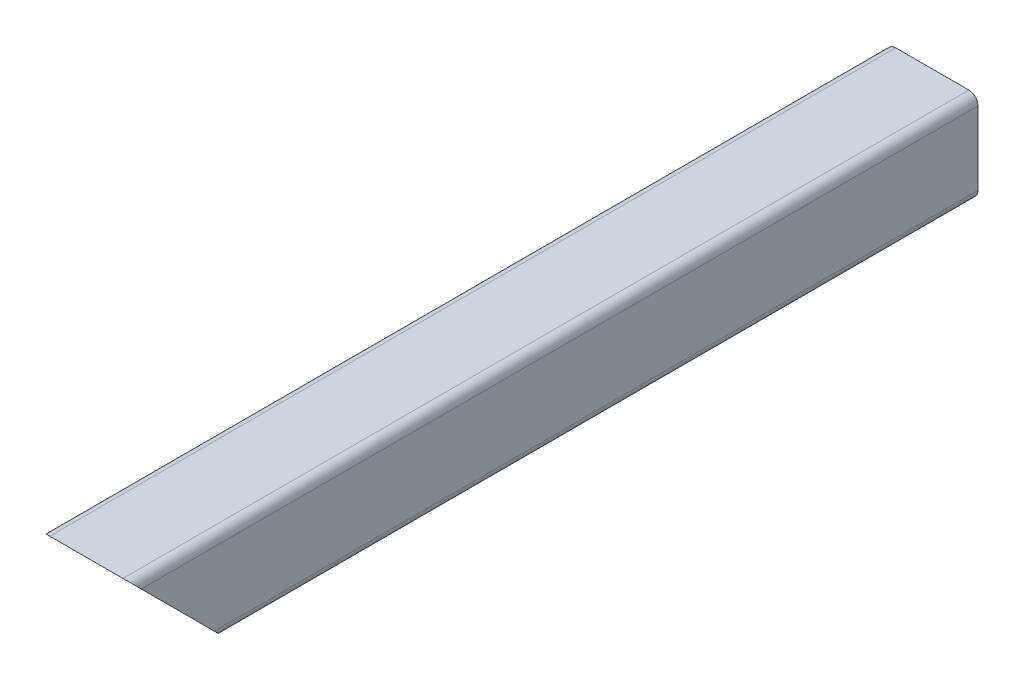
ISO-10303-21;
HEADER;
FILE_DESCRIPTION(('STEP AP214'),'2;1');
FILE_NAME('part.step','',(''),(''),'','','');
FILE_SCHEMA(('AUTOMOTIVE_DESIGN { 1 0 10303 214 1 1 1 1 }'));
ENDSEC;
DATA;
#1=APPLICATION_CONTEXT('core data for automotive mechanical design processes');
#2=APPLICATION_PROTOCOL_DEFINITION('international standard','automotive_design',2000,#1);
#3=PRODUCT_CONTEXT('',#1,'mechanical');
#4=PRODUCT('Part','Part','',(#3));
#5=PRODUCT_RELATED_PRODUCT_CATEGORY('part','',(#4));
#6=PRODUCT_DEFINITION_FORMATION('','',#4);
#7=PRODUCT_DEFINITION_CONTEXT('part definition',#1,'design');
#8=PRODUCT_DEFINITION('design','',#6,#7);
#9=PRODUCT_DEFINITION_SHAPE('','',#8);
#10=(LENGTH_UNIT() NAMED_UNIT(*) SI_UNIT(.MILLI.,.METRE.));
#11=(NAMED_UNIT(*) PLANE_ANGLE_UNIT() SI_UNIT($,.RADIAN.));
#12=(NAMED_UNIT(*) SI_UNIT($,.STERADIAN.) SOLID_ANGLE_UNIT());
#13=UNCERTAINTY_MEASURE_WITH_UNIT(LENGTH_MEASURE(1.E-05),#10,'distance_accuracy_value','');
#14=(GEOMETRIC_REPRESENTATION_CONTEXT(3) GLOBAL_UNCERTAINTY_ASSIGNED_CONTEXT((#13)) GLOBAL_UNIT_ASSIGNED_CONTEXT((#10,
#11,#12)) REPRESENTATION_CONTEXT('',''));
#15=CARTESIAN_POINT('',(0.,0.,0.));
#16=DIRECTION('',(0.,0.,1.));
#17=DIRECTION('',(1.,0.,0.));
#18=AXIS2_PLACEMENT_3D('',#15,#16,#17);
#19=CARTESIAN_POINT('',(16.,-16.,370.));
#20=DIRECTION('',(0.,0.,-1.));
#21=DIRECTION('',(-1.,0.,0.));
#22=AXIS2_PLACEMENT_3D('',#19,#20,#21);
#23=CYLINDRICAL_SURFACE('',#22,4.);
#24=CARTESIAN_POINT('',(16.,-16.,334.));
#25=DIRECTION('',(0.,-0.707106781186544,0.707106781186551));
#26=DIRECTION('',(0.,-0.707106781186551,-0.707106781186544));
#27=AXIS2_PLACEMENT_3D('',#24,#25,#26);
#28=ELLIPSE('',#27,5.65685424949235,4.);
#29=CARTESIAN_POINT('',(16.,-20.,330.));
#30=VERTEX_POINT('',#29);
#31=CARTESIAN_POINT('',(20.,-16.,334.));
#32=VERTEX_POINT('',#31);
#33=EDGE_CURVE('E145',#30,#32,#28,.T.);
#34=ORIENTED_EDGE('',*,*,#33,.F.);
#35=DIRECTION('',(0.,0.,-1.));
#36=VECTOR('',#35,1.);
#37=CARTESIAN_POINT('',(16.,-20.,370.));
#38=LINE('',#37,#36);
#39=CARTESIAN_POINT('',(16.,-20.,0.));
#40=VERTEX_POINT('',#39);
#41=EDGE_CURVE('E155',#30,#40,#38,.T.);
#42=ORIENTED_EDGE('',*,*,#41,.T.);
#43=CARTESIAN_POINT('',(16.,-16.,0.));
#44=DIRECTION('',(0.,0.,1.));
#45=DIRECTION('',(-1.,0.,0.));
#46=AXIS2_PLACEMENT_3D('',#43,#44,#45);
#47=CIRCLE('',#46,4.);
#48=CARTESIAN_POINT('',(20.,-16.,0.));
#49=VERTEX_POINT('',#48);
#50=EDGE_CURVE('E193',#40,#49,#47,.T.);
#51=ORIENTED_EDGE('',*,*,#50,.T.);
#52=DIRECTION('',(0.,0.,-1.));
#53=VECTOR('',#52,1.);
#54=CARTESIAN_POINT('',(20.,-16.,370.));
#55=LINE('',#54,#53);
#56=EDGE_CURVE('E41',#32,#49,#55,.T.);
#57=ORIENTED_EDGE('',*,*,#56,.F.);
#58=EDGE_LOOP('',(#34,#42,#51,#57));
#59=FACE_BOUND('',#58,.T.);
#60=ADVANCED_FACE('F34',(#59),#23,.T.);
#61=CARTESIAN_POINT('',(20.,16.,370.));
#62=DIRECTION('',(-1.,0.,0.));
#63=DIRECTION('',(0.,-1.,0.));
#64=AXIS2_PLACEMENT_3D('',#61,#62,#63);
#65=PLANE('',#64);
#66=DIRECTION('',(0.,0.707106781186551,0.707106781186544));
#67=VECTOR('',#66,1.);
#68=CARTESIAN_POINT('',(20.,18.,368.));
#69=LINE('',#68,#67);
#70=CARTESIAN_POINT('',(20.,16.,366.));
#71=VERTEX_POINT('',#70);
#72=EDGE_CURVE('E158',#32,#71,#69,.T.);
#73=ORIENTED_EDGE('',*,*,#72,.F.);
#74=ORIENTED_EDGE('',*,*,#56,.T.);
#75=DIRECTION('',(0.,1.,0.));
#76=VECTOR('',#75,1.);
#77=CARTESIAN_POINT('',(20.,16.,0.));
#78=LINE('',#77,#76);
#79=CARTESIAN_POINT('',(20.,16.,0.));
#80=VERTEX_POINT('',#79);
#81=EDGE_CURVE('E188',#49,#80,#78,.T.);
#82=ORIENTED_EDGE('',*,*,#81,.T.);
#83=DIRECTION('',(0.,0.,-1.));
#84=VECTOR('',#83,1.);
#85=CARTESIAN_POINT('',(20.,16.,370.));
#86=LINE('',#85,#84);
#87=EDGE_CURVE('E182',#71,#80,#86,.T.);
#88=ORIENTED_EDGE('',*,*,#87,.F.);
#89=EDGE_LOOP('',(#73,#74,#82,#88));
#90=FACE_BOUND('',#89,.T.);
#91=ADVANCED_FACE('F186',(#90),#65,.F.);
#92=CARTESIAN_POINT('',(16.,16.,370.));
#93=DIRECTION('',(0.,0.,-1.));
#94=DIRECTION('',(-1.,0.,0.));
#95=AXIS2_PLACEMENT_3D('',#92,#93,#94);
#96=CYLINDRICAL_SURFACE('',#95,4.);
#97=CARTESIAN_POINT('',(16.,16.,366.));
#98=DIRECTION('',(0.,-0.707106781186544,0.707106781186551));
#99=DIRECTION('',(0.,-0.707106781186551,-0.707106781186544));
#100=AXIS2_PLACEMENT_3D('',#97,#98,#99);
#101=ELLIPSE('',#100,5.65685424949235,4.);
#102=CARTESIAN_POINT('',(16.,20.,370.));
#103=VERTEX_POINT('',#102);
#104=EDGE_CURVE('E235',#71,#103,#101,.T.);
#105=ORIENTED_EDGE('',*,*,#104,.F.);
#106=ORIENTED_EDGE('',*,*,#87,.T.);
#107=CARTESIAN_POINT('',(16.,16.,0.));
#108=DIRECTION('',(0.,0.,1.));
#109=DIRECTION('',(-1.,0.,0.));
#110=AXIS2_PLACEMENT_3D('',#107,#108,#109);
#111=CIRCLE('',#110,4.);
#112=CARTESIAN_POINT('',(16.,20.,0.));
#113=VERTEX_POINT('',#112);
#114=EDGE_CURVE('E195',#80,#113,#111,.T.);
#115=ORIENTED_EDGE('',*,*,#114,.T.);
#116=DIRECTION('',(0.,0.,-1.));
#117=VECTOR('',#116,1.);
#118=CARTESIAN_POINT('',(16.,20.,370.));
#119=LINE('',#118,#117);
#120=EDGE_CURVE('E179',#103,#113,#119,.T.);
#121=ORIENTED_EDGE('',*,*,#120,.F.);
#122=EDGE_LOOP('',(#105,#106,#115,#121));
#123=FACE_BOUND('',#122,.T.);
#124=ADVANCED_FACE('F234',(#123),#96,.T.);
#125=CARTESIAN_POINT('',(-16.,16.,370.));
#126=DIRECTION('',(0.,0.,-1.));
#127=DIRECTION('',(-1.,0.,0.));
#128=AXIS2_PLACEMENT_3D('',#125,#126,#127);
#129=CYLINDRICAL_SURFACE('',#128,4.);
#130=CARTESIAN_POINT('',(-16.,16.,366.));
#131=DIRECTION('',(0.,-0.707106781186544,0.707106781186551));
#132=DIRECTION('',(0.,-0.707106781186551,-0.707106781186544));
#133=AXIS2_PLACEMENT_3D('',#130,#131,#132);
#134=ELLIPSE('',#133,5.65685424949235,4.);
#135=CARTESIAN_POINT('',(-16.,20.,370.));
#136=VERTEX_POINT('',#135);
#137=CARTESIAN_POINT('',(-20.,16.,366.));
#138=VERTEX_POINT('',#137);
#139=EDGE_CURVE('E227',#136,#138,#134,.T.);
#140=ORIENTED_EDGE('',*,*,#139,.F.);
#141=DIRECTION('',(0.,0.,-1.));
#142=VECTOR('',#141,1.);
#143=CARTESIAN_POINT('',(-16.,20.,370.));
#144=LINE('',#143,#142);
#145=CARTESIAN_POINT('',(-16.,20.,0.));
#146=VERTEX_POINT('',#145);
#147=EDGE_CURVE('E176',#136,#146,#144,.T.);
#148=ORIENTED_EDGE('',*,*,#147,.T.);
#149=CARTESIAN_POINT('',(-16.,16.,0.));
#150=DIRECTION('',(0.,0.,1.));
#151=DIRECTION('',(1.,0.,0.));
#152=AXIS2_PLACEMENT_3D('',#149,#150,#151);
#153=CIRCLE('',#152,4.);
#154=CARTESIAN_POINT('',(-20.,16.,0.));
#155=VERTEX_POINT('',#154);
#156=EDGE_CURVE('E205',#146,#155,#153,.T.);
#157=ORIENTED_EDGE('',*,*,#156,.T.);
#158=DIRECTION('',(0.,0.,-1.));
#159=VECTOR('',#158,1.);
#160=CARTESIAN_POINT('',(-20.,16.,370.));
#161=LINE('',#160,#159);
#162=EDGE_CURVE('E174',#138,#155,#161,.T.);
#163=ORIENTED_EDGE('',*,*,#162,.F.);
#164=EDGE_LOOP('',(#140,#148,#157,#163));
#165=FACE_BOUND('',#164,.T.);
#166=ADVANCED_FACE('F225',(#165),#129,.T.);
#167=CARTESIAN_POINT('',(-20.,16.,370.));
#168=DIRECTION('',(1.,0.,0.));
#169=DIRECTION('',(0.,1.,0.));
#170=AXIS2_PLACEMENT_3D('',#167,#168,#169);
#171=PLANE('',#170);
#172=DIRECTION('',(0.,-0.707106781186551,-0.707106781186544));
#173=VECTOR('',#172,1.);
#174=CARTESIAN_POINT('',(-20.,18.,368.));
#175=LINE('',#174,#173);
#176=CARTESIAN_POINT('',(-20.,-16.,334.));
#177=VERTEX_POINT('',#176);
#178=EDGE_CURVE('E222',#138,#177,#175,.T.);
#179=ORIENTED_EDGE('',*,*,#178,.F.);
#180=ORIENTED_EDGE('',*,*,#162,.T.);
#181=DIRECTION('',(0.,-1.,0.));
#182=VECTOR('',#181,1.);
#183=CARTESIAN_POINT('',(-20.,16.,0.));
#184=LINE('',#183,#182);
#185=CARTESIAN_POINT('',(-20.,-16.,0.));
#186=VERTEX_POINT('',#185);
#187=EDGE_CURVE('E208',#155,#186,#184,.T.);
#188=ORIENTED_EDGE('',*,*,#187,.T.);
#189=DIRECTION('',(0.,0.,-1.));
#190=VECTOR('',#189,1.);
#191=CARTESIAN_POINT('',(-20.,-16.,370.));
#192=LINE('',#191,#190);
#193=EDGE_CURVE('E167',#177,#186,#192,.T.);
#194=ORIENTED_EDGE('',*,*,#193,.F.);
#195=EDGE_LOOP('',(#179,#180,#188,#194));
#196=FACE_BOUND('',#195,.T.);
#197=ADVANCED_FACE('F220',(#196),#171,.F.);
#198=CARTESIAN_POINT('',(-16.,-16.,370.));
#199=DIRECTION('',(0.,0.,-1.));
#200=DIRECTION('',(-1.,0.,0.));
#201=AXIS2_PLACEMENT_3D('',#198,#199,#200);
#202=CYLINDRICAL_SURFACE('',#201,4.);
#203=CARTESIAN_POINT('',(-16.,-16.,334.));
#204=DIRECTION('',(0.,-0.707106781186544,0.707106781186551));
#205=DIRECTION('',(0.,-0.707106781186551,-0.707106781186544));
#206=AXIS2_PLACEMENT_3D('',#203,#204,#205);
#207=ELLIPSE('',#206,5.65685424949236,4.);
#208=CARTESIAN_POINT('',(-16.,-20.,330.));
#209=VERTEX_POINT('',#208);
#210=EDGE_CURVE('E48',#177,#209,#207,.T.);
#211=ORIENTED_EDGE('',*,*,#210,.F.);
#212=ORIENTED_EDGE('',*,*,#193,.T.);
#213=CARTESIAN_POINT('',(-16.,-16.,0.));
#214=DIRECTION('',(0.,0.,1.));
#215=DIRECTION('',(1.,0.,0.));
#216=AXIS2_PLACEMENT_3D('',#213,#214,#215);
#217=CIRCLE('',#216,4.);
#218=CARTESIAN_POINT('',(-16.,-20.,0.));
#219=VERTEX_POINT('',#218);
#220=EDGE_CURVE('E210',#186,#219,#217,.T.);
#221=ORIENTED_EDGE('',*,*,#220,.T.);
#222=DIRECTION('',(0.,0.,-1.));
#223=VECTOR('',#222,1.);
#224=CARTESIAN_POINT('',(-16.,-20.,370.));
#225=LINE('',#224,#223);
#226=EDGE_CURVE('E164',#209,#219,#225,.T.);
#227=ORIENTED_EDGE('',*,*,#226,.F.);
#228=EDGE_LOOP('',(#211,#212,#221,#227));
#229=FACE_BOUND('',#228,.T.);
#230=ADVANCED_FACE('F214',(#229),#202,.T.);
#231=CARTESIAN_POINT('',(-16.,-20.,370.));
#232=DIRECTION('',(0.,1.,0.));
#233=DIRECTION('',(0.,0.,1.));
#234=AXIS2_PLACEMENT_3D('',#231,#232,#233);
#235=PLANE('',#234);
#236=DIRECTION('',(-1.,0.,0.));
#237=VECTOR('',#236,1.);
#238=CARTESIAN_POINT('',(41.,-20.,330.));
#239=LINE('',#238,#237);
#240=EDGE_CURVE('E142',#30,#209,#239,.T.);
#241=ORIENTED_EDGE('',*,*,#240,.T.);
#242=ORIENTED_EDGE('',*,*,#226,.T.);
#243=DIRECTION('',(1.,0.,0.));
#244=VECTOR('',#243,1.);
#245=CARTESIAN_POINT('',(-16.,-20.,0.));
#246=LINE('',#245,#244);
#247=EDGE_CURVE('E162',#219,#40,#246,.T.);
#248=ORIENTED_EDGE('',*,*,#247,.T.);
#249=ORIENTED_EDGE('',*,*,#41,.F.);
#250=EDGE_LOOP('',(#241,#242,#248,#249));
#251=FACE_BOUND('',#250,.T.);
#252=ADVANCED_FACE('F160',(#251),#235,.F.);
#253=CARTESIAN_POINT('',(-16.,16.,370.));
#254=DIRECTION('',(0.,0.,-1.));
#255=DIRECTION('',(-1.,0.,0.));
#256=AXIS2_PLACEMENT_3D('',#253,#254,#255);
#257=CYLINDRICAL_SURFACE('',#256,2.);
#258=DIRECTION('',(0.,0.,-1.));
#259=VECTOR('',#258,1.);
#260=CARTESIAN_POINT('',(-16.,18.,370.));
#261=LINE('',#260,#259);
#262=CARTESIAN_POINT('',(-16.,18.,368.));
#263=VERTEX_POINT('',#262);
#264=CARTESIAN_POINT('',(-16.,18.,0.));
#265=VERTEX_POINT('',#264);
#266=EDGE_CURVE('E264',#263,#265,#261,.T.);
#267=ORIENTED_EDGE('',*,*,#266,.F.);
#268=CARTESIAN_POINT('',(-16.,16.,366.));
#269=DIRECTION('',(0.,-0.707106781186544,0.707106781186551));
#270=DIRECTION('',(0.,-0.707106781186551,-0.707106781186544));
#271=AXIS2_PLACEMENT_3D('',#268,#269,#270);
#272=ELLIPSE('',#271,2.82842712474617,2.);
#273=CARTESIAN_POINT('',(-18.,16.,366.));
#274=VERTEX_POINT('',#273);
#275=EDGE_CURVE('E56',#263,#274,#272,.T.);
#276=ORIENTED_EDGE('',*,*,#275,.T.);
#277=DIRECTION('',(0.,0.,-1.));
#278=VECTOR('',#277,1.);
#279=CARTESIAN_POINT('',(-18.,16.,370.));
#280=LINE('',#279,#278);
#281=CARTESIAN_POINT('',(-18.,16.,0.));
#282=VERTEX_POINT('',#281);
#283=EDGE_CURVE('E197',#274,#282,#280,.T.);
#284=ORIENTED_EDGE('',*,*,#283,.T.);
#285=CARTESIAN_POINT('',(-16.,16.,0.));
#286=DIRECTION('',(0.,0.,1.));
#287=DIRECTION('',(1.,0.,0.));
#288=AXIS2_PLACEMENT_3D('',#285,#286,#287);
#289=CIRCLE('',#288,2.);
#290=EDGE_CURVE('E157',#265,#282,#289,.T.);
#291=ORIENTED_EDGE('',*,*,#290,.F.);
#292=EDGE_LOOP('',(#267,#276,#284,#291));
#293=FACE_BOUND('',#292,.T.);
#294=ADVANCED_FACE('F293',(#293),#257,.F.);
#295=CARTESIAN_POINT('',(-18.,16.,370.));
#296=DIRECTION('',(1.,0.,0.));
#297=DIRECTION('',(0.,1.,0.));
#298=AXIS2_PLACEMENT_3D('',#295,#296,#297);
#299=PLANE('',#298);
#300=ORIENTED_EDGE('',*,*,#283,.F.);
#301=DIRECTION('',(0.,-0.707106781186551,-0.707106781186544));
#302=VECTOR('',#301,1.);
#303=CARTESIAN_POINT('',(-18.,18.,368.));
#304=LINE('',#303,#302);
#305=CARTESIAN_POINT('',(-18.,-16.,334.));
#306=VERTEX_POINT('',#305);
#307=EDGE_CURVE('E283',#274,#306,#304,.T.);
#308=ORIENTED_EDGE('',*,*,#307,.T.);
#309=DIRECTION('',(0.,0.,-1.));
#310=VECTOR('',#309,1.);
#311=CARTESIAN_POINT('',(-18.,-16.,370.));
#312=LINE('',#311,#310);
#313=CARTESIAN_POINT('',(-18.,-16.,0.));
#314=VERTEX_POINT('',#313);
#315=EDGE_CURVE('E199',#306,#314,#312,.T.);
#316=ORIENTED_EDGE('',*,*,#315,.T.);
#317=DIRECTION('',(0.,-1.,0.));
#318=VECTOR('',#317,1.);
#319=CARTESIAN_POINT('',(-18.,16.,0.));
#320=LINE('',#319,#318);
#321=EDGE_CURVE('E243',#282,#314,#320,.T.);
#322=ORIENTED_EDGE('',*,*,#321,.F.);
#323=EDGE_LOOP('',(#300,#308,#316,#322));
#324=FACE_BOUND('',#323,.T.);
#325=ADVANCED_FACE('F282',(#324),#299,.T.);
#326=CARTESIAN_POINT('',(-16.,-16.,370.));
#327=DIRECTION('',(0.,0.,-1.));
#328=DIRECTION('',(-1.,0.,0.));
#329=AXIS2_PLACEMENT_3D('',#326,#327,#328);
#330=CYLINDRICAL_SURFACE('',#329,2.);
#331=ORIENTED_EDGE('',*,*,#315,.F.);
#332=CARTESIAN_POINT('',(-16.,-16.,334.));
#333=DIRECTION('',(0.,-0.707106781186544,0.707106781186551));
#334=DIRECTION('',(0.,-0.707106781186551,-0.707106781186544));
#335=AXIS2_PLACEMENT_3D('',#332,#333,#334);
#336=ELLIPSE('',#335,2.82842712474618,2.);
#337=CARTESIAN_POINT('',(-16.,-18.,332.));
#338=VERTEX_POINT('',#337);
#339=EDGE_CURVE('E296',#306,#338,#336,.T.);
#340=ORIENTED_EDGE('',*,*,#339,.T.);
#341=DIRECTION('',(0.,0.,-1.));
#342=VECTOR('',#341,1.);
#343=CARTESIAN_POINT('',(-16.,-18.,370.));
#344=LINE('',#343,#342);
#345=CARTESIAN_POINT('',(-16.,-18.,0.));
#346=VERTEX_POINT('',#345);
#347=EDGE_CURVE('E274',#338,#346,#344,.T.);
#348=ORIENTED_EDGE('',*,*,#347,.T.);
#349=CARTESIAN_POINT('',(-16.,-16.,0.));
#350=DIRECTION('',(0.,0.,1.));
#351=DIRECTION('',(1.,0.,0.));
#352=AXIS2_PLACEMENT_3D('',#349,#350,#351);
#353=CIRCLE('',#352,2.);
#354=EDGE_CURVE('E246',#314,#346,#353,.T.);
#355=ORIENTED_EDGE('',*,*,#354,.F.);
#356=EDGE_LOOP('',(#331,#340,#348,#355));
#357=FACE_BOUND('',#356,.T.);
#358=ADVANCED_FACE('F286',(#357),#330,.F.);
#359=CARTESIAN_POINT('',(-16.,-18.,370.));
#360=DIRECTION('',(0.,1.,0.));
#361=DIRECTION('',(0.,0.,1.));
#362=AXIS2_PLACEMENT_3D('',#359,#360,#361);
#363=PLANE('',#362);
#364=ORIENTED_EDGE('',*,*,#347,.F.);
#365=DIRECTION('',(1.,0.,0.));
#366=VECTOR('',#365,1.);
#367=CARTESIAN_POINT('',(-16.,-18.,332.));
#368=LINE('',#367,#366);
#369=CARTESIAN_POINT('',(16.,-18.,332.));
#370=VERTEX_POINT('',#369);
#371=EDGE_CURVE('E300',#338,#370,#368,.T.);
#372=ORIENTED_EDGE('',*,*,#371,.T.);
#373=DIRECTION('',(0.,0.,-1.));
#374=VECTOR('',#373,1.);
#375=CARTESIAN_POINT('',(16.,-18.,370.));
#376=LINE('',#375,#374);
#377=CARTESIAN_POINT('',(16.,-18.,0.));
#378=VERTEX_POINT('',#377);
#379=EDGE_CURVE('E272',#370,#378,#376,.T.);
#380=ORIENTED_EDGE('',*,*,#379,.T.);
#381=DIRECTION('',(1.,0.,0.));
#382=VECTOR('',#381,1.);
#383=CARTESIAN_POINT('',(-16.,-18.,0.));
#384=LINE('',#383,#382);
#385=EDGE_CURVE('E249',#346,#378,#384,.T.);
#386=ORIENTED_EDGE('',*,*,#385,.F.);
#387=EDGE_LOOP('',(#364,#372,#380,#386));
#388=FACE_BOUND('',#387,.T.);
#389=ADVANCED_FACE('F326',(#388),#363,.T.);
#390=CARTESIAN_POINT('',(16.,-16.,370.));
#391=DIRECTION('',(0.,0.,-1.));
#392=DIRECTION('',(-1.,0.,0.));
#393=AXIS2_PLACEMENT_3D('',#390,#391,#392);
#394=CYLINDRICAL_SURFACE('',#393,2.);
#395=ORIENTED_EDGE('',*,*,#379,.F.);
#396=CARTESIAN_POINT('',(16.,-16.,334.));
#397=DIRECTION('',(0.,-0.707106781186544,0.707106781186551));
#398=DIRECTION('',(0.,-0.707106781186551,-0.707106781186544));
#399=AXIS2_PLACEMENT_3D('',#396,#397,#398);
#400=ELLIPSE('',#399,2.82842712474618,2.);
#401=CARTESIAN_POINT('',(18.,-16.,334.));
#402=VERTEX_POINT('',#401);
#403=EDGE_CURVE('E303',#370,#402,#400,.T.);
#404=ORIENTED_EDGE('',*,*,#403,.T.);
#405=DIRECTION('',(0.,0.,-1.));
#406=VECTOR('',#405,1.);
#407=CARTESIAN_POINT('',(18.,-16.,370.));
#408=LINE('',#407,#406);
#409=CARTESIAN_POINT('',(18.,-16.,0.));
#410=VERTEX_POINT('',#409);
#411=EDGE_CURVE('E270',#402,#410,#408,.T.);
#412=ORIENTED_EDGE('',*,*,#411,.T.);
#413=CARTESIAN_POINT('',(16.,-16.,0.));
#414=DIRECTION('',(0.,0.,1.));
#415=DIRECTION('',(-1.,0.,0.));
#416=AXIS2_PLACEMENT_3D('',#413,#414,#415);
#417=CIRCLE('',#416,2.);
#418=EDGE_CURVE('E252',#378,#410,#417,.T.);
#419=ORIENTED_EDGE('',*,*,#418,.F.);
#420=EDGE_LOOP('',(#395,#404,#412,#419));
#421=FACE_BOUND('',#420,.T.);
#422=ADVANCED_FACE('F324',(#421),#394,.F.);
#423=CARTESIAN_POINT('',(18.,16.,370.));
#424=DIRECTION('',(-1.,0.,0.));
#425=DIRECTION('',(0.,0.,1.));
#426=AXIS2_PLACEMENT_3D('',#423,#424,#425);
#427=PLANE('',#426);
#428=ORIENTED_EDGE('',*,*,#411,.F.);
#429=DIRECTION('',(0.,0.707106781186551,0.707106781186544));
#430=VECTOR('',#429,1.);
#431=CARTESIAN_POINT('',(18.,18.,368.));
#432=LINE('',#431,#430);
#433=CARTESIAN_POINT('',(18.,16.,366.));
#434=VERTEX_POINT('',#433);
#435=EDGE_CURVE('E306',#402,#434,#432,.T.);
#436=ORIENTED_EDGE('',*,*,#435,.T.);
#437=DIRECTION('',(0.,0.,-1.));
#438=VECTOR('',#437,1.);
#439=CARTESIAN_POINT('',(18.,16.,370.));
#440=LINE('',#439,#438);
#441=CARTESIAN_POINT('',(18.,16.,0.));
#442=VERTEX_POINT('',#441);
#443=EDGE_CURVE('E268',#434,#442,#440,.T.);
#444=ORIENTED_EDGE('',*,*,#443,.T.);
#445=DIRECTION('',(0.,1.,0.));
#446=VECTOR('',#445,1.);
#447=CARTESIAN_POINT('',(18.,16.,0.));
#448=LINE('',#447,#446);
#449=EDGE_CURVE('E255',#410,#442,#448,.T.);
#450=ORIENTED_EDGE('',*,*,#449,.F.);
#451=EDGE_LOOP('',(#428,#436,#444,#450));
#452=FACE_BOUND('',#451,.T.);
#453=ADVANCED_FACE('F321',(#452),#427,.T.);
#454=CARTESIAN_POINT('',(16.,16.,370.));
#455=DIRECTION('',(0.,0.,-1.));
#456=DIRECTION('',(-1.,0.,0.));
#457=AXIS2_PLACEMENT_3D('',#454,#455,#456);
#458=CYLINDRICAL_SURFACE('',#457,2.);
#459=ORIENTED_EDGE('',*,*,#443,.F.);
#460=CARTESIAN_POINT('',(16.,16.,366.));
#461=DIRECTION('',(0.,-0.707106781186544,0.707106781186551));
#462=DIRECTION('',(0.,-0.707106781186551,-0.707106781186544));
#463=AXIS2_PLACEMENT_3D('',#460,#461,#462);
#464=ELLIPSE('',#463,2.82842712474618,2.);
#465=CARTESIAN_POINT('',(16.,18.,368.));
#466=VERTEX_POINT('',#465);
#467=EDGE_CURVE('E150',#434,#466,#464,.T.);
#468=ORIENTED_EDGE('',*,*,#467,.T.);
#469=DIRECTION('',(0.,0.,-1.));
#470=VECTOR('',#469,1.);
#471=CARTESIAN_POINT('',(16.,18.,370.));
#472=LINE('',#471,#470);
#473=CARTESIAN_POINT('',(16.,18.,0.));
#474=VERTEX_POINT('',#473);
#475=EDGE_CURVE('E266',#466,#474,#472,.T.);
#476=ORIENTED_EDGE('',*,*,#475,.T.);
#477=CARTESIAN_POINT('',(16.,16.,0.));
#478=DIRECTION('',(0.,0.,1.));
#479=DIRECTION('',(-1.,0.,0.));
#480=AXIS2_PLACEMENT_3D('',#477,#478,#479);
#481=CIRCLE('',#480,2.);
#482=EDGE_CURVE('E258',#442,#474,#481,.T.);
#483=ORIENTED_EDGE('',*,*,#482,.F.);
#484=EDGE_LOOP('',(#459,#468,#476,#483));
#485=FACE_BOUND('',#484,.T.);
#486=ADVANCED_FACE('F313',(#485),#458,.F.);
#487=CARTESIAN_POINT('',(-16.,18.,370.));
#488=DIRECTION('',(0.,-1.,0.));
#489=DIRECTION('',(0.,0.,-1.));
#490=AXIS2_PLACEMENT_3D('',#487,#488,#489);
#491=PLANE('',#490);
#492=ORIENTED_EDGE('',*,*,#475,.F.);
#493=DIRECTION('',(-1.,0.,0.));
#494=VECTOR('',#493,1.);
#495=CARTESIAN_POINT('',(-16.,18.,368.));
#496=LINE('',#495,#494);
#497=EDGE_CURVE('E11',#466,#263,#496,.T.);
#498=ORIENTED_EDGE('',*,*,#497,.T.);
#499=ORIENTED_EDGE('',*,*,#266,.T.);
#500=DIRECTION('',(-1.,0.,0.));
#501=VECTOR('',#500,1.);
#502=CARTESIAN_POINT('',(-16.,18.,0.));
#503=LINE('',#502,#501);
#504=EDGE_CURVE('E261',#474,#265,#503,.T.);
#505=ORIENTED_EDGE('',*,*,#504,.F.);
#506=EDGE_LOOP('',(#492,#498,#499,#505));
#507=FACE_BOUND('',#506,.T.);
#508=ADVANCED_FACE('F316',(#507),#491,.T.);
#509=CARTESIAN_POINT('',(16.,-16.,0.));
#510=DIRECTION('',(0.,0.,-1.));
#511=DIRECTION('',(-1.,0.,0.));
#512=AXIS2_PLACEMENT_3D('',#509,#510,#511);
#513=PLANE('',#512);
#514=ORIENTED_EDGE('',*,*,#50,.F.);
#515=ORIENTED_EDGE('',*,*,#247,.F.);
#516=ORIENTED_EDGE('',*,*,#220,.F.);
#517=ORIENTED_EDGE('',*,*,#187,.F.);
#518=ORIENTED_EDGE('',*,*,#156,.F.);
#519=DIRECTION('',(-1.,0.,0.));
#520=VECTOR('',#519,1.);
#521=CARTESIAN_POINT('',(-16.,20.,0.));
#522=LINE('',#521,#520);
#523=EDGE_CURVE('E203',#113,#146,#522,.T.);
#524=ORIENTED_EDGE('',*,*,#523,.F.);
#525=ORIENTED_EDGE('',*,*,#114,.F.);
#526=ORIENTED_EDGE('',*,*,#81,.F.);
#527=EDGE_LOOP('',(#514,#515,#516,#517,#518,#524,#525,#526));
#528=FACE_BOUND('',#527,.T.);
#529=ORIENTED_EDGE('',*,*,#504,.T.);
#530=ORIENTED_EDGE('',*,*,#290,.T.);
#531=ORIENTED_EDGE('',*,*,#321,.T.);
#532=ORIENTED_EDGE('',*,*,#354,.T.);
#533=ORIENTED_EDGE('',*,*,#385,.T.);
#534=ORIENTED_EDGE('',*,*,#418,.T.);
#535=ORIENTED_EDGE('',*,*,#449,.T.);
#536=ORIENTED_EDGE('',*,*,#482,.T.);
#537=EDGE_LOOP('',(#529,#530,#531,#532,#533,#534,#535,#536));
#538=FACE_BOUND('',#537,.T.);
#539=ADVANCED_FACE('F191',(#528,#538),#513,.T.);
#540=CARTESIAN_POINT('',(-16.,20.,370.));
#541=DIRECTION('',(0.,-1.,0.));
#542=DIRECTION('',(0.,0.,-1.));
#543=AXIS2_PLACEMENT_3D('',#540,#541,#542);
#544=PLANE('',#543);
#545=ORIENTED_EDGE('',*,*,#523,.T.);
#546=ORIENTED_EDGE('',*,*,#147,.F.);
#547=DIRECTION('',(-1.,0.,0.));
#548=VECTOR('',#547,1.);
#549=CARTESIAN_POINT('',(-16.,20.,370.));
#550=LINE('',#549,#548);
#551=EDGE_CURVE('E165',#103,#136,#550,.T.);
#552=ORIENTED_EDGE('',*,*,#551,.F.);
#553=ORIENTED_EDGE('',*,*,#120,.T.);
#554=EDGE_LOOP('',(#545,#546,#552,#553));
#555=FACE_BOUND('',#554,.T.);
#556=ADVANCED_FACE('F230',(#555),#544,.F.);
#557=CARTESIAN_POINT('',(41.,20.,370.));
#558=DIRECTION('',(0.,-0.707106781186544,0.707106781186551));
#559=DIRECTION('',(0.,-0.707106781186551,-0.707106781186544));
#560=AXIS2_PLACEMENT_3D('',#557,#558,#559);
#561=PLANE('',#560);
#562=ORIENTED_EDGE('',*,*,#497,.F.);
#563=ORIENTED_EDGE('',*,*,#467,.F.);
#564=ORIENTED_EDGE('',*,*,#435,.F.);
#565=ORIENTED_EDGE('',*,*,#403,.F.);
#566=ORIENTED_EDGE('',*,*,#371,.F.);
#567=ORIENTED_EDGE('',*,*,#339,.F.);
#568=ORIENTED_EDGE('',*,*,#307,.F.);
#569=ORIENTED_EDGE('',*,*,#275,.F.);
#570=EDGE_LOOP('',(#562,#563,#564,#565,#566,#567,#568,#569));
#571=FACE_BOUND('',#570,.T.);
#572=ORIENTED_EDGE('',*,*,#33,.T.);
#573=ORIENTED_EDGE('',*,*,#72,.T.);
#574=ORIENTED_EDGE('',*,*,#104,.T.);
#575=ORIENTED_EDGE('',*,*,#551,.T.);
#576=ORIENTED_EDGE('',*,*,#139,.T.);
#577=ORIENTED_EDGE('',*,*,#178,.T.);
#578=ORIENTED_EDGE('',*,*,#210,.T.);
#579=ORIENTED_EDGE('',*,*,#240,.F.);
#580=EDGE_LOOP('',(#572,#573,#574,#575,#576,#577,#578,#579));
#581=FACE_BOUND('',#580,.T.);
#582=ADVANCED_FACE('F144',(#571,#581),#561,.T.);
#583=CLOSED_SHELL('',(#60,#91,#124,#166,#197,#230,#252,#294,#325,#358,#389,#422,#453,#486,#508,
#539,#556,#582));
#584=MANIFOLD_SOLID_BREP('B2',#583);
#585=ADVANCED_BREP_SHAPE_REPRESENTATION('',(#18,#584),#14);
#586=SHAPE_DEFINITION_REPRESENTATION(#9,#585);
ENDSEC;
END-ISO-10303-21;
